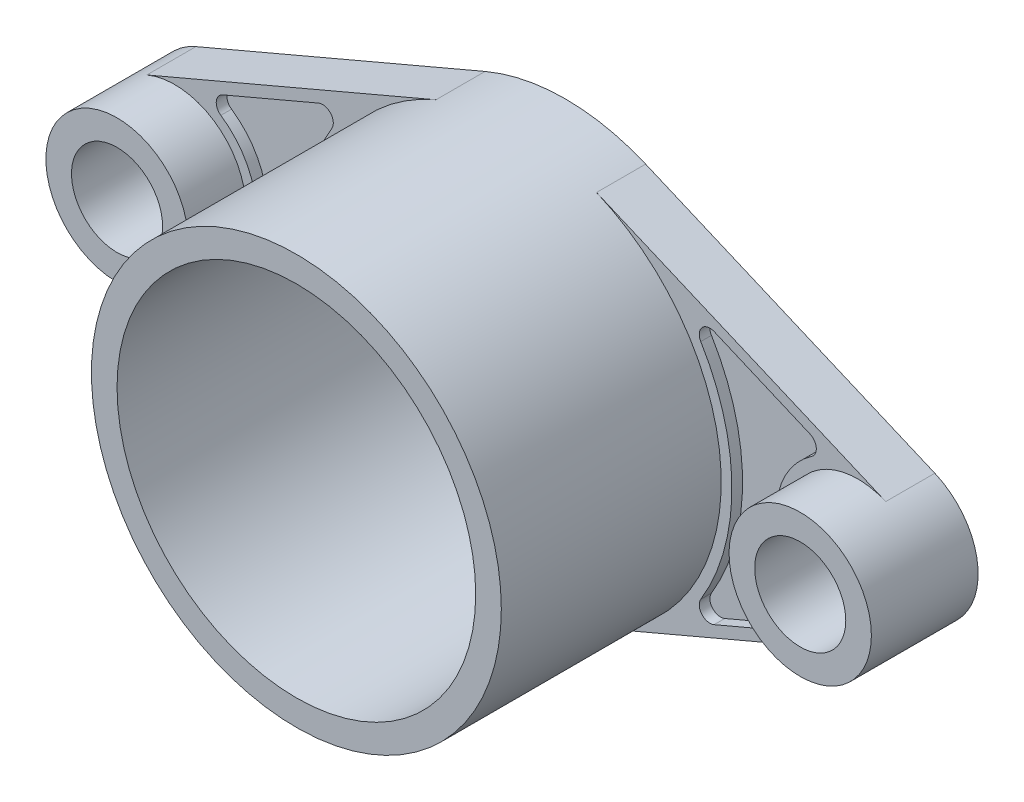
ISO-10303-21;
HEADER;
FILE_DESCRIPTION(('STEP AP214'),'2;1');
FILE_NAME('part.step','',(''),(''),'','','');
FILE_SCHEMA(('AUTOMOTIVE_DESIGN { 1 0 10303 214 1 1 1 1 }'));
ENDSEC;
DATA;
#1=APPLICATION_CONTEXT('core data for automotive mechanical design processes');
#2=APPLICATION_PROTOCOL_DEFINITION('international standard','automotive_design',2000,#1);
#3=PRODUCT_CONTEXT('',#1,'mechanical');
#4=PRODUCT('Part','Part','',(#3));
#5=PRODUCT_RELATED_PRODUCT_CATEGORY('part','',(#4));
#6=PRODUCT_DEFINITION_FORMATION('','',#4);
#7=PRODUCT_DEFINITION_CONTEXT('part definition',#1,'design');
#8=PRODUCT_DEFINITION('design','',#6,#7);
#9=PRODUCT_DEFINITION_SHAPE('','',#8);
#10=(LENGTH_UNIT() NAMED_UNIT(*) SI_UNIT(.MILLI.,.METRE.));
#11=(NAMED_UNIT(*) PLANE_ANGLE_UNIT() SI_UNIT($,.RADIAN.));
#12=(NAMED_UNIT(*) SI_UNIT($,.STERADIAN.) SOLID_ANGLE_UNIT());
#13=UNCERTAINTY_MEASURE_WITH_UNIT(LENGTH_MEASURE(1.E-05),#10,'distance_accuracy_value','');
#14=(GEOMETRIC_REPRESENTATION_CONTEXT(3) GLOBAL_UNCERTAINTY_ASSIGNED_CONTEXT((#13)) GLOBAL_UNIT_ASSIGNED_CONTEXT((#10,
#11,#12)) REPRESENTATION_CONTEXT('',''));
#15=CARTESIAN_POINT('',(0.,0.,0.));
#16=DIRECTION('',(0.,0.,1.));
#17=DIRECTION('',(1.,0.,0.));
#18=AXIS2_PLACEMENT_3D('',#15,#16,#17);
#19=CARTESIAN_POINT('',(-18.8,44.1651446278624,11.5));
#20=DIRECTION('',(0.391666666666667,-0.920107179747132,0.));
#21=DIRECTION('',(0.920107179747133,0.391666666666667,0.));
#22=AXIS2_PLACEMENT_3D('',#19,#20,#21);
#23=PLANE('',#22);
#24=DIRECTION('',(-0.920107179747133,-0.391666666666667,0.));
#25=VECTOR('',#24,1.);
#26=CARTESIAN_POINT('',(-18.8,44.1651446278624,0.));
#27=LINE('',#26,#25);
#28=CARTESIAN_POINT('',(-18.8,44.1651446278624,0.));
#29=VERTEX_POINT('',#28);
#30=CARTESIAN_POINT('',(-86.5277777777778,15.3351196624522,0.));
#31=VERTEX_POINT('',#30);
#32=EDGE_CURVE('E355',#29,#31,#27,.T.);
#33=ORIENTED_EDGE('',*,*,#32,.T.);
#34=DIRECTION('',(0.,0.,-1.));
#35=VECTOR('',#34,1.);
#36=CARTESIAN_POINT('',(-86.5277777777778,15.3351196624522,11.5));
#37=LINE('',#36,#35);
#38=CARTESIAN_POINT('',(-86.5277777777778,15.3351196624522,11.5));
#39=VERTEX_POINT('',#38);
#40=EDGE_CURVE('E11',#39,#31,#37,.T.);
#41=ORIENTED_EDGE('',*,*,#40,.F.);
#42=DIRECTION('',(-0.920107179747133,-0.391666666666667,0.));
#43=VECTOR('',#42,1.);
#44=CARTESIAN_POINT('',(-18.8,44.1651446278624,11.5));
#45=LINE('',#44,#43);
#46=CARTESIAN_POINT('',(-18.8,44.1651446278624,11.5));
#47=VERTEX_POINT('',#46);
#48=EDGE_CURVE('E377',#47,#39,#45,.T.);
#49=ORIENTED_EDGE('',*,*,#48,.F.);
#50=DIRECTION('',(0.,0.,-1.));
#51=VECTOR('',#50,1.);
#52=CARTESIAN_POINT('',(-18.8,44.1651446278624,11.5));
#53=LINE('',#52,#51);
#54=EDGE_CURVE('E391',#47,#29,#53,.T.);
#55=ORIENTED_EDGE('',*,*,#54,.T.);
#56=EDGE_LOOP('',(#33,#41,#49,#55));
#57=FACE_BOUND('',#56,.T.);
#58=ADVANCED_FACE('F47',(#57),#23,.F.);
#59=CARTESIAN_POINT('',(-18.8,-44.1651446278624,11.5));
#60=DIRECTION('',(-0.391666666666667,-0.920107179747133,0.));
#61=DIRECTION('',(0.920107179747133,-0.391666666666667,0.));
#62=AXIS2_PLACEMENT_3D('',#59,#60,#61);
#63=PLANE('',#62);
#64=DIRECTION('',(-0.920107179747133,0.391666666666667,0.));
#65=VECTOR('',#64,1.);
#66=CARTESIAN_POINT('',(-18.8,-44.1651446278624,0.));
#67=LINE('',#66,#65);
#68=CARTESIAN_POINT('',(-18.8,-44.1651446278624,0.));
#69=VERTEX_POINT('',#68);
#70=CARTESIAN_POINT('',(-86.5277777777778,-15.3351196624522,0.));
#71=VERTEX_POINT('',#70);
#72=EDGE_CURVE('E381',#69,#71,#67,.T.);
#73=ORIENTED_EDGE('',*,*,#72,.F.);
#74=DIRECTION('',(0.,0.,-1.));
#75=VECTOR('',#74,1.);
#76=CARTESIAN_POINT('',(-18.8,-44.1651446278624,11.5));
#77=LINE('',#76,#75);
#78=CARTESIAN_POINT('',(-18.8,-44.1651446278624,11.5));
#79=VERTEX_POINT('',#78);
#80=EDGE_CURVE('E399',#79,#69,#77,.T.);
#81=ORIENTED_EDGE('',*,*,#80,.F.);
#82=DIRECTION('',(-0.920107179747133,0.391666666666667,0.));
#83=VECTOR('',#82,1.);
#84=CARTESIAN_POINT('',(-18.8,-44.1651446278624,11.5));
#85=LINE('',#84,#83);
#86=CARTESIAN_POINT('',(-86.5277777777778,-15.3351196624522,11.5));
#87=VERTEX_POINT('',#86);
#88=EDGE_CURVE('E384',#79,#87,#85,.T.);
#89=ORIENTED_EDGE('',*,*,#88,.T.);
#90=DIRECTION('',(0.,0.,-1.));
#91=VECTOR('',#90,1.);
#92=CARTESIAN_POINT('',(-86.5277777777778,-15.3351196624522,11.5));
#93=LINE('',#92,#91);
#94=EDGE_CURVE('E55',#87,#71,#93,.T.);
#95=ORIENTED_EDGE('',*,*,#94,.T.);
#96=EDGE_LOOP('',(#73,#81,#89,#95));
#97=FACE_BOUND('',#96,.T.);
#98=ADVANCED_FACE('F408',(#97),#63,.T.);
#99=CARTESIAN_POINT('',(0.,0.,11.5));
#100=DIRECTION('',(0.,0.,1.));
#101=DIRECTION('',(1.,0.,0.));
#102=AXIS2_PLACEMENT_3D('',#99,#100,#101);
#103=PLANE('',#102);
#104=CARTESIAN_POINT('',(-80.,0.,11.5));
#105=DIRECTION('',(0.,0.,-1.));
#106=DIRECTION('',(1.,0.,0.));
#107=AXIS2_PLACEMENT_3D('',#104,#105,#106);
#108=CIRCLE('',#107,19.1666666666667);
#109=CARTESIAN_POINT('',(-69.181739923407,15.8217053450728,11.5));
#110=VERTEX_POINT('',#109);
#111=CARTESIAN_POINT('',(-69.181739923407,-15.8217053450728,11.5));
#112=VERTEX_POINT('',#111);
#113=EDGE_CURVE('E282',#110,#112,#108,.T.);
#114=ORIENTED_EDGE('',*,*,#113,.F.);
#115=CARTESIAN_POINT('',(-67.7706625221122,17.8854060422562,11.5));
#116=DIRECTION('',(0.,0.,1.));
#117=DIRECTION('',(-1.,0.,0.));
#118=AXIS2_PLACEMENT_3D('',#115,#116,#117);
#119=CIRCLE('',#118,2.5);
#120=CARTESIAN_POINT('',(-68.7498291887789,20.185673991624,11.5));
#121=VERTEX_POINT('',#120);
#122=EDGE_CURVE('E294',#121,#110,#119,.T.);
#123=ORIENTED_EDGE('',*,*,#122,.F.);
#124=DIRECTION('',(-0.920107179747132,-0.391666666666668,0.));
#125=VECTOR('',#124,1.);
#126=CARTESIAN_POINT('',(-46.3293116044255,29.729528860378,11.5));
#127=LINE('',#126,#125);
#128=CARTESIAN_POINT('',(-46.3293116044255,29.7295288603779,11.5));
#129=VERTEX_POINT('',#128);
#130=EDGE_CURVE('E345',#129,#121,#127,.T.);
#131=ORIENTED_EDGE('',*,*,#130,.F.);
#132=CARTESIAN_POINT('',(-45.3501449377588,27.4292609110101,11.5));
#133=DIRECTION('',(0.,0.,1.));
#134=DIRECTION('',(-1.,0.,0.));
#135=AXIS2_PLACEMENT_3D('',#132,#133,#134);
#136=CIRCLE('',#135,2.50000000000001);
#137=CARTESIAN_POINT('',(-43.2109871576759,26.13542784917,11.5));
#138=VERTEX_POINT('',#137);
#139=EDGE_CURVE('E341',#138,#129,#136,.T.);
#140=ORIENTED_EDGE('',*,*,#139,.F.);
#141=CARTESIAN_POINT('',(0.,0.,11.5));
#142=DIRECTION('',(0.,0.,-1.));
#143=DIRECTION('',(1.,0.,0.));
#144=AXIS2_PLACEMENT_3D('',#141,#142,#143);
#145=CIRCLE('',#144,50.5);
#146=CARTESIAN_POINT('',(-43.2109871576759,-26.13542784917,11.5));
#147=VERTEX_POINT('',#146);
#148=EDGE_CURVE('E337',#147,#138,#145,.T.);
#149=ORIENTED_EDGE('',*,*,#148,.F.);
#150=CARTESIAN_POINT('',(-45.3501449377588,-27.4292609110101,11.5));
#151=DIRECTION('',(0.,0.,1.));
#152=DIRECTION('',(1.,0.,0.));
#153=AXIS2_PLACEMENT_3D('',#150,#151,#152);
#154=CIRCLE('',#153,2.50000000000001);
#155=CARTESIAN_POINT('',(-46.3293116044255,-29.729528860378,11.5));
#156=VERTEX_POINT('',#155);
#157=EDGE_CURVE('E333',#156,#147,#154,.T.);
#158=ORIENTED_EDGE('',*,*,#157,.F.);
#159=DIRECTION('',(0.920107179747132,-0.391666666666668,0.));
#160=VECTOR('',#159,1.);
#161=CARTESIAN_POINT('',(-68.7498291887789,-20.185673991624,11.5));
#162=LINE('',#161,#160);
#163=CARTESIAN_POINT('',(-68.7498291887789,-20.185673991624,11.5));
#164=VERTEX_POINT('',#163);
#165=EDGE_CURVE('E329',#164,#156,#162,.T.);
#166=ORIENTED_EDGE('',*,*,#165,.F.);
#167=CARTESIAN_POINT('',(-67.7706625221122,-17.8854060422562,11.5));
#168=DIRECTION('',(0.,0.,1.));
#169=DIRECTION('',(1.,0.,0.));
#170=AXIS2_PLACEMENT_3D('',#167,#168,#169);
#171=CIRCLE('',#170,2.5);
#172=EDGE_CURVE('E325',#112,#164,#171,.T.);
#173=ORIENTED_EDGE('',*,*,#172,.F.);
#174=EDGE_LOOP('',(#114,#123,#131,#140,#149,#158,#166,#173));
#175=FACE_BOUND('',#174,.T.);
#176=ORIENTED_EDGE('',*,*,#48,.T.);
#177=CARTESIAN_POINT('',(-80.,0.,11.5));
#178=DIRECTION('',(0.,0.,1.));
#179=DIRECTION('',(1.,0.,0.));
#180=AXIS2_PLACEMENT_3D('',#177,#178,#179);
#181=CIRCLE('',#180,16.6666666666667);
#182=EDGE_CURVE('E380',#39,#87,#181,.F.);
#183=ORIENTED_EDGE('',*,*,#182,.T.);
#184=ORIENTED_EDGE('',*,*,#88,.F.);
#185=CARTESIAN_POINT('',(0.,0.,11.5));
#186=DIRECTION('',(0.,0.,1.));
#187=DIRECTION('',(1.,0.,0.));
#188=AXIS2_PLACEMENT_3D('',#185,#186,#187);
#189=CIRCLE('',#188,48.);
#190=EDGE_CURVE('E388',#47,#79,#189,.T.);
#191=ORIENTED_EDGE('',*,*,#190,.F.);
#192=EDGE_LOOP('',(#176,#183,#184,#191));
#193=FACE_BOUND('',#192,.T.);
#194=ADVANCED_FACE('F420',(#175,#193),#103,.T.);
#195=CARTESIAN_POINT('',(0.,0.,0.));
#196=DIRECTION('',(0.,0.,1.));
#197=DIRECTION('',(1.,0.,0.));
#198=AXIS2_PLACEMENT_3D('',#195,#196,#197);
#199=PLANE('',#198);
#200=ORIENTED_EDGE('',*,*,#32,.F.);
#201=CARTESIAN_POINT('',(0.,0.,0.));
#202=DIRECTION('',(0.,0.,1.));
#203=DIRECTION('',(1.,0.,0.));
#204=AXIS2_PLACEMENT_3D('',#201,#202,#203);
#205=CIRCLE('',#204,48.);
#206=CARTESIAN_POINT('',(18.8,44.1651446278624,0.));
#207=VERTEX_POINT('',#206);
#208=EDGE_CURVE('E236',#207,#29,#205,.T.);
#209=ORIENTED_EDGE('',*,*,#208,.F.);
#210=DIRECTION('',(0.920107179747133,-0.391666666666667,0.));
#211=VECTOR('',#210,1.);
#212=CARTESIAN_POINT('',(18.8,44.1651446278624,0.));
#213=LINE('',#212,#211);
#214=CARTESIAN_POINT('',(86.5277777777778,15.3351196624522,0.));
#215=VERTEX_POINT('',#214);
#216=EDGE_CURVE('E226',#207,#215,#213,.T.);
#217=ORIENTED_EDGE('',*,*,#216,.T.);
#218=CARTESIAN_POINT('',(80.,0.,0.));
#219=DIRECTION('',(0.,0.,1.));
#220=DIRECTION('',(1.,0.,0.));
#221=AXIS2_PLACEMENT_3D('',#218,#219,#220);
#222=CIRCLE('',#221,16.6666666666667);
#223=CARTESIAN_POINT('',(86.5277777777778,-15.3351196624522,0.));
#224=VERTEX_POINT('',#223);
#225=EDGE_CURVE('E207',#224,#215,#222,.T.);
#226=ORIENTED_EDGE('',*,*,#225,.F.);
#227=DIRECTION('',(0.920107179747133,0.391666666666667,0.));
#228=VECTOR('',#227,1.);
#229=CARTESIAN_POINT('',(18.8,-44.1651446278624,0.));
#230=LINE('',#229,#228);
#231=CARTESIAN_POINT('',(18.8,-44.1651446278624,0.));
#232=VERTEX_POINT('',#231);
#233=EDGE_CURVE('E238',#232,#224,#230,.T.);
#234=ORIENTED_EDGE('',*,*,#233,.F.);
#235=EDGE_CURVE('E263',#69,#232,#205,.T.);
#236=ORIENTED_EDGE('',*,*,#235,.F.);
#237=ORIENTED_EDGE('',*,*,#72,.T.);
#238=CARTESIAN_POINT('',(-80.,0.,0.));
#239=DIRECTION('',(0.,0.,1.));
#240=DIRECTION('',(1.,0.,0.));
#241=AXIS2_PLACEMENT_3D('',#238,#239,#240);
#242=CIRCLE('',#241,16.6666666666667);
#243=EDGE_CURVE('E267',#71,#31,#242,.F.);
#244=ORIENTED_EDGE('',*,*,#243,.T.);
#245=EDGE_LOOP('',(#200,#209,#217,#226,#234,#236,#237,#244));
#246=FACE_BOUND('',#245,.T.);
#247=CARTESIAN_POINT('',(-80.,0.,0.));
#248=DIRECTION('',(0.,0.,1.));
#249=DIRECTION('',(1.,0.,0.));
#250=AXIS2_PLACEMENT_3D('',#247,#248,#249);
#251=CIRCLE('',#250,10.6666666666667);
#252=CARTESIAN_POINT('',(-69.3333333333333,0.,0.));
#253=VERTEX_POINT('',#252);
#254=EDGE_CURVE('E278',#253,#253,#251,.F.);
#255=ORIENTED_EDGE('',*,*,#254,.F.);
#256=EDGE_LOOP('',(#255));
#257=FACE_BOUND('',#256,.T.);
#258=CARTESIAN_POINT('',(0.,0.,0.));
#259=DIRECTION('',(0.,0.,1.));
#260=DIRECTION('',(1.,0.,0.));
#261=AXIS2_PLACEMENT_3D('',#258,#259,#260);
#262=CIRCLE('',#261,42.);
#263=CARTESIAN_POINT('',(42.,0.,0.));
#264=VERTEX_POINT('',#263);
#265=EDGE_CURVE('E230',#264,#264,#262,.T.);
#266=ORIENTED_EDGE('',*,*,#265,.T.);
#267=EDGE_LOOP('',(#266));
#268=FACE_BOUND('',#267,.T.);
#269=CARTESIAN_POINT('',(80.,0.,0.));
#270=DIRECTION('',(0.,0.,1.));
#271=DIRECTION('',(1.,0.,0.));
#272=AXIS2_PLACEMENT_3D('',#269,#270,#271);
#273=CIRCLE('',#272,10.6666666666667);
#274=CARTESIAN_POINT('',(90.6666666666667,0.,0.));
#275=VERTEX_POINT('',#274);
#276=EDGE_CURVE('E220',#275,#275,#273,.T.);
#277=ORIENTED_EDGE('',*,*,#276,.T.);
#278=EDGE_LOOP('',(#277));
#279=FACE_BOUND('',#278,.T.);
#280=ADVANCED_FACE('F234',(#246,#257,#268,#279),#199,.F.);
#281=CARTESIAN_POINT('',(-80.,0.,9.));
#282=DIRECTION('',(0.,0.,1.));
#283=DIRECTION('',(1.,0.,0.));
#284=AXIS2_PLACEMENT_3D('',#281,#282,#283);
#285=CYLINDRICAL_SURFACE('',#284,19.1666666666667);
#286=ORIENTED_EDGE('',*,*,#113,.T.);
#287=DIRECTION('',(0.,0.,1.));
#288=VECTOR('',#287,1.);
#289=CARTESIAN_POINT('',(-69.181739923407,-15.8217053450728,9.));
#290=LINE('',#289,#288);
#291=CARTESIAN_POINT('',(-69.181739923407,-15.8217053450728,9.));
#292=VERTEX_POINT('',#291);
#293=EDGE_CURVE('E322',#292,#112,#290,.T.);
#294=ORIENTED_EDGE('',*,*,#293,.F.);
#295=CARTESIAN_POINT('',(-80.,0.,9.));
#296=DIRECTION('',(0.,0.,-1.));
#297=DIRECTION('',(1.,0.,0.));
#298=AXIS2_PLACEMENT_3D('',#295,#296,#297);
#299=CIRCLE('',#298,19.1666666666667);
#300=CARTESIAN_POINT('',(-69.181739923407,15.8217053450728,9.));
#301=VERTEX_POINT('',#300);
#302=EDGE_CURVE('E289',#301,#292,#299,.T.);
#303=ORIENTED_EDGE('',*,*,#302,.F.);
#304=DIRECTION('',(0.,0.,1.));
#305=VECTOR('',#304,1.);
#306=CARTESIAN_POINT('',(-69.181739923407,15.8217053450728,9.));
#307=LINE('',#306,#305);
#308=EDGE_CURVE('E352',#301,#110,#307,.T.);
#309=ORIENTED_EDGE('',*,*,#308,.T.);
#310=EDGE_LOOP('',(#286,#294,#303,#309));
#311=FACE_BOUND('',#310,.T.);
#312=ADVANCED_FACE('F552',(#311),#285,.T.);
#313=CARTESIAN_POINT('',(-67.7706625221122,17.8854060422562,9.));
#314=DIRECTION('',(0.,0.,1.));
#315=DIRECTION('',(1.,0.,0.));
#316=AXIS2_PLACEMENT_3D('',#313,#314,#315);
#317=CYLINDRICAL_SURFACE('',#316,2.5);
#318=ORIENTED_EDGE('',*,*,#122,.T.);
#319=ORIENTED_EDGE('',*,*,#308,.F.);
#320=CARTESIAN_POINT('',(-67.7706625221122,17.8854060422562,9.));
#321=DIRECTION('',(0.,0.,1.));
#322=DIRECTION('',(-1.,0.,0.));
#323=AXIS2_PLACEMENT_3D('',#320,#321,#322);
#324=CIRCLE('',#323,2.5);
#325=CARTESIAN_POINT('',(-68.7498291887789,20.185673991624,9.));
#326=VERTEX_POINT('',#325);
#327=EDGE_CURVE('E318',#326,#301,#324,.T.);
#328=ORIENTED_EDGE('',*,*,#327,.F.);
#329=DIRECTION('',(0.,0.,1.));
#330=VECTOR('',#329,1.);
#331=CARTESIAN_POINT('',(-68.7498291887789,20.185673991624,9.));
#332=LINE('',#331,#330);
#333=EDGE_CURVE('E356',#326,#121,#332,.T.);
#334=ORIENTED_EDGE('',*,*,#333,.T.);
#335=EDGE_LOOP('',(#318,#319,#328,#334));
#336=FACE_BOUND('',#335,.T.);
#337=ADVANCED_FACE('F556',(#336),#317,.F.);
#338=CARTESIAN_POINT('',(-46.3293116044255,29.729528860378,9.));
#339=DIRECTION('',(-0.391666666666668,0.920107179747132,0.));
#340=DIRECTION('',(-0.920107179747132,-0.391666666666668,0.));
#341=AXIS2_PLACEMENT_3D('',#338,#339,#340);
#342=PLANE('',#341);
#343=ORIENTED_EDGE('',*,*,#130,.T.);
#344=ORIENTED_EDGE('',*,*,#333,.F.);
#345=DIRECTION('',(-0.920107179747132,-0.391666666666668,0.));
#346=VECTOR('',#345,1.);
#347=CARTESIAN_POINT('',(-46.3293116044255,29.729528860378,9.));
#348=LINE('',#347,#346);
#349=CARTESIAN_POINT('',(-46.3293116044255,29.7295288603779,9.));
#350=VERTEX_POINT('',#349);
#351=EDGE_CURVE('E314',#350,#326,#348,.T.);
#352=ORIENTED_EDGE('',*,*,#351,.F.);
#353=DIRECTION('',(0.,0.,1.));
#354=VECTOR('',#353,1.);
#355=CARTESIAN_POINT('',(-46.3293116044255,29.7295288603779,9.));
#356=LINE('',#355,#354);
#357=EDGE_CURVE('E359',#350,#129,#356,.T.);
#358=ORIENTED_EDGE('',*,*,#357,.T.);
#359=EDGE_LOOP('',(#343,#344,#352,#358));
#360=FACE_BOUND('',#359,.T.);
#361=ADVANCED_FACE('F578',(#360),#342,.F.);
#362=CARTESIAN_POINT('',(-45.3501449377588,27.4292609110101,9.));
#363=DIRECTION('',(0.,0.,1.));
#364=DIRECTION('',(1.,0.,0.));
#365=AXIS2_PLACEMENT_3D('',#362,#363,#364);
#366=CYLINDRICAL_SURFACE('',#365,2.50000000000001);
#367=ORIENTED_EDGE('',*,*,#139,.T.);
#368=ORIENTED_EDGE('',*,*,#357,.F.);
#369=CARTESIAN_POINT('',(-45.3501449377588,27.4292609110101,9.));
#370=DIRECTION('',(0.,0.,1.));
#371=DIRECTION('',(-1.,0.,0.));
#372=AXIS2_PLACEMENT_3D('',#369,#370,#371);
#373=CIRCLE('',#372,2.50000000000001);
#374=CARTESIAN_POINT('',(-43.2109871576759,26.13542784917,9.));
#375=VERTEX_POINT('',#374);
#376=EDGE_CURVE('E310',#375,#350,#373,.T.);
#377=ORIENTED_EDGE('',*,*,#376,.F.);
#378=DIRECTION('',(0.,0.,1.));
#379=VECTOR('',#378,1.);
#380=CARTESIAN_POINT('',(-43.2109871576759,26.13542784917,9.));
#381=LINE('',#380,#379);
#382=EDGE_CURVE('E362',#375,#138,#381,.T.);
#383=ORIENTED_EDGE('',*,*,#382,.T.);
#384=EDGE_LOOP('',(#367,#368,#377,#383));
#385=FACE_BOUND('',#384,.T.);
#386=ADVANCED_FACE('F574',(#385),#366,.F.);
#387=CARTESIAN_POINT('',(0.,0.,9.));
#388=DIRECTION('',(0.,0.,1.));
#389=DIRECTION('',(1.,0.,0.));
#390=AXIS2_PLACEMENT_3D('',#387,#388,#389);
#391=CYLINDRICAL_SURFACE('',#390,50.5);
#392=ORIENTED_EDGE('',*,*,#148,.T.);
#393=ORIENTED_EDGE('',*,*,#382,.F.);
#394=CARTESIAN_POINT('',(0.,0.,9.));
#395=DIRECTION('',(0.,0.,-1.));
#396=DIRECTION('',(1.,0.,0.));
#397=AXIS2_PLACEMENT_3D('',#394,#395,#396);
#398=CIRCLE('',#397,50.5);
#399=CARTESIAN_POINT('',(-43.2109871576759,-26.13542784917,9.));
#400=VERTEX_POINT('',#399);
#401=EDGE_CURVE('E306',#400,#375,#398,.T.);
#402=ORIENTED_EDGE('',*,*,#401,.F.);
#403=DIRECTION('',(0.,0.,1.));
#404=VECTOR('',#403,1.);
#405=CARTESIAN_POINT('',(-43.2109871576759,-26.13542784917,9.));
#406=LINE('',#405,#404);
#407=EDGE_CURVE('E365',#400,#147,#406,.T.);
#408=ORIENTED_EDGE('',*,*,#407,.T.);
#409=EDGE_LOOP('',(#392,#393,#402,#408));
#410=FACE_BOUND('',#409,.T.);
#411=ADVANCED_FACE('F570',(#410),#391,.T.);
#412=CARTESIAN_POINT('',(-45.3501449377588,-27.4292609110101,9.));
#413=DIRECTION('',(0.,0.,1.));
#414=DIRECTION('',(1.,0.,0.));
#415=AXIS2_PLACEMENT_3D('',#412,#413,#414);
#416=CYLINDRICAL_SURFACE('',#415,2.50000000000001);
#417=ORIENTED_EDGE('',*,*,#157,.T.);
#418=ORIENTED_EDGE('',*,*,#407,.F.);
#419=CARTESIAN_POINT('',(-45.3501449377588,-27.4292609110101,9.));
#420=DIRECTION('',(0.,0.,1.));
#421=DIRECTION('',(1.,0.,0.));
#422=AXIS2_PLACEMENT_3D('',#419,#420,#421);
#423=CIRCLE('',#422,2.50000000000001);
#424=CARTESIAN_POINT('',(-46.3293116044255,-29.729528860378,9.));
#425=VERTEX_POINT('',#424);
#426=EDGE_CURVE('E302',#425,#400,#423,.T.);
#427=ORIENTED_EDGE('',*,*,#426,.F.);
#428=DIRECTION('',(0.,0.,1.));
#429=VECTOR('',#428,1.);
#430=CARTESIAN_POINT('',(-46.3293116044255,-29.729528860378,9.));
#431=LINE('',#430,#429);
#432=EDGE_CURVE('E368',#425,#156,#431,.T.);
#433=ORIENTED_EDGE('',*,*,#432,.T.);
#434=EDGE_LOOP('',(#417,#418,#427,#433));
#435=FACE_BOUND('',#434,.T.);
#436=ADVANCED_FACE('F566',(#435),#416,.F.);
#437=CARTESIAN_POINT('',(-68.7498291887789,-20.185673991624,9.));
#438=DIRECTION('',(-0.391666666666668,-0.920107179747132,0.));
#439=DIRECTION('',(0.920107179747132,-0.391666666666668,0.));
#440=AXIS2_PLACEMENT_3D('',#437,#438,#439);
#441=PLANE('',#440);
#442=ORIENTED_EDGE('',*,*,#165,.T.);
#443=ORIENTED_EDGE('',*,*,#432,.F.);
#444=DIRECTION('',(0.920107179747132,-0.391666666666668,0.));
#445=VECTOR('',#444,1.);
#446=CARTESIAN_POINT('',(-68.7498291887789,-20.185673991624,9.));
#447=LINE('',#446,#445);
#448=CARTESIAN_POINT('',(-68.7498291887789,-20.185673991624,9.));
#449=VERTEX_POINT('',#448);
#450=EDGE_CURVE('E298',#449,#425,#447,.T.);
#451=ORIENTED_EDGE('',*,*,#450,.F.);
#452=DIRECTION('',(0.,0.,1.));
#453=VECTOR('',#452,1.);
#454=CARTESIAN_POINT('',(-68.7498291887789,-20.185673991624,9.));
#455=LINE('',#454,#453);
#456=EDGE_CURVE('E371',#449,#164,#455,.T.);
#457=ORIENTED_EDGE('',*,*,#456,.T.);
#458=EDGE_LOOP('',(#442,#443,#451,#457));
#459=FACE_BOUND('',#458,.T.);
#460=ADVANCED_FACE('F562',(#459),#441,.F.);
#461=CARTESIAN_POINT('',(-67.7706625221122,-17.8854060422562,9.));
#462=DIRECTION('',(0.,0.,1.));
#463=DIRECTION('',(1.,0.,0.));
#464=AXIS2_PLACEMENT_3D('',#461,#462,#463);
#465=CYLINDRICAL_SURFACE('',#464,2.5);
#466=ORIENTED_EDGE('',*,*,#172,.T.);
#467=ORIENTED_EDGE('',*,*,#456,.F.);
#468=CARTESIAN_POINT('',(-67.7706625221122,-17.8854060422562,9.));
#469=DIRECTION('',(0.,0.,1.));
#470=DIRECTION('',(1.,0.,0.));
#471=AXIS2_PLACEMENT_3D('',#468,#469,#470);
#472=CIRCLE('',#471,2.5);
#473=EDGE_CURVE('E293',#292,#449,#472,.T.);
#474=ORIENTED_EDGE('',*,*,#473,.F.);
#475=ORIENTED_EDGE('',*,*,#293,.T.);
#476=EDGE_LOOP('',(#466,#467,#474,#475));
#477=FACE_BOUND('',#476,.T.);
#478=ADVANCED_FACE('F558',(#477),#465,.F.);
#479=CARTESIAN_POINT('',(-80.,0.,9.));
#480=DIRECTION('',(0.,0.,1.));
#481=DIRECTION('',(1.,0.,0.));
#482=AXIS2_PLACEMENT_3D('',#479,#480,#481);
#483=PLANE('',#482);
#484=ORIENTED_EDGE('',*,*,#302,.T.);
#485=ORIENTED_EDGE('',*,*,#473,.T.);
#486=ORIENTED_EDGE('',*,*,#450,.T.);
#487=ORIENTED_EDGE('',*,*,#426,.T.);
#488=ORIENTED_EDGE('',*,*,#401,.T.);
#489=ORIENTED_EDGE('',*,*,#376,.T.);
#490=ORIENTED_EDGE('',*,*,#351,.T.);
#491=ORIENTED_EDGE('',*,*,#327,.T.);
#492=EDGE_LOOP('',(#484,#485,#486,#487,#488,#489,#490,#491));
#493=FACE_BOUND('',#492,.T.);
#494=ADVANCED_FACE('F561',(#493),#483,.T.);
#495=CARTESIAN_POINT('',(-80.,0.,25.));
#496=DIRECTION('',(0.,0.,-1.));
#497=DIRECTION('',(-1.,0.,0.));
#498=AXIS2_PLACEMENT_3D('',#495,#496,#497);
#499=CYLINDRICAL_SURFACE('',#498,16.6666666666667);
#500=ORIENTED_EDGE('',*,*,#182,.F.);
#501=ORIENTED_EDGE('',*,*,#40,.T.);
#502=ORIENTED_EDGE('',*,*,#243,.F.);
#503=ORIENTED_EDGE('',*,*,#94,.F.);
#504=EDGE_LOOP('',(#500,#501,#502,#503));
#505=FACE_BOUND('',#504,.T.);
#506=CARTESIAN_POINT('',(-80.,0.,25.));
#507=DIRECTION('',(0.,0.,1.));
#508=DIRECTION('',(1.,0.,0.));
#509=AXIS2_PLACEMENT_3D('',#506,#507,#508);
#510=CIRCLE('',#509,16.6666666666667);
#511=CARTESIAN_POINT('',(-63.3333333333333,0.,25.));
#512=VERTEX_POINT('',#511);
#513=EDGE_CURVE('E273',#512,#512,#510,.F.);
#514=ORIENTED_EDGE('',*,*,#513,.T.);
#515=EDGE_LOOP('',(#514));
#516=FACE_BOUND('',#515,.T.);
#517=ADVANCED_FACE('F413',(#505,#516),#499,.T.);
#518=CARTESIAN_POINT('',(-80.,0.,25.));
#519=DIRECTION('',(0.,0.,-1.));
#520=DIRECTION('',(-1.,0.,0.));
#521=AXIS2_PLACEMENT_3D('',#518,#519,#520);
#522=CYLINDRICAL_SURFACE('',#521,10.6666666666667);
#523=CARTESIAN_POINT('',(-80.,0.,25.));
#524=DIRECTION('',(0.,0.,1.));
#525=DIRECTION('',(1.,0.,0.));
#526=AXIS2_PLACEMENT_3D('',#523,#524,#525);
#527=CIRCLE('',#526,10.6666666666667);
#528=CARTESIAN_POINT('',(-69.3333333333333,0.,25.));
#529=VERTEX_POINT('',#528);
#530=EDGE_CURVE('E277',#529,#529,#527,.F.);
#531=ORIENTED_EDGE('',*,*,#530,.F.);
#532=EDGE_LOOP('',(#531));
#533=FACE_BOUND('',#532,.T.);
#534=ORIENTED_EDGE('',*,*,#254,.T.);
#535=EDGE_LOOP('',(#534));
#536=FACE_BOUND('',#535,.T.);
#537=ADVANCED_FACE('F591',(#533,#536),#522,.F.);
#538=CARTESIAN_POINT('',(0.,0.,25.));
#539=DIRECTION('',(0.,0.,1.));
#540=DIRECTION('',(1.,0.,0.));
#541=AXIS2_PLACEMENT_3D('',#538,#539,#540);
#542=PLANE('',#541);
#543=ORIENTED_EDGE('',*,*,#513,.F.);
#544=EDGE_LOOP('',(#543));
#545=FACE_BOUND('',#544,.T.);
#546=ORIENTED_EDGE('',*,*,#530,.T.);
#547=EDGE_LOOP('',(#546));
#548=FACE_BOUND('',#547,.T.);
#549=ADVANCED_FACE('F594',(#545,#548),#542,.T.);
#550=CARTESIAN_POINT('',(0.,0.,63.));
#551=DIRECTION('',(0.,0.,-1.));
#552=DIRECTION('',(-1.,0.,0.));
#553=AXIS2_PLACEMENT_3D('',#550,#551,#552);
#554=CYLINDRICAL_SURFACE('',#553,48.);
#555=CARTESIAN_POINT('',(0.,0.,11.5));
#556=DIRECTION('',(0.,0.,1.));
#557=DIRECTION('',(1.,0.,0.));
#558=AXIS2_PLACEMENT_3D('',#555,#556,#557);
#559=CIRCLE('',#558,48.);
#560=CARTESIAN_POINT('',(18.8,-44.1651446278624,11.5));
#561=VERTEX_POINT('',#560);
#562=CARTESIAN_POINT('',(18.8,44.1651446278624,11.5));
#563=VERTEX_POINT('',#562);
#564=EDGE_CURVE('E62',#561,#563,#559,.T.);
#565=ORIENTED_EDGE('',*,*,#564,.T.);
#566=DIRECTION('',(0.,0.,-1.));
#567=VECTOR('',#566,1.);
#568=CARTESIAN_POINT('',(18.8,44.1651446278624,11.5));
#569=LINE('',#568,#567);
#570=EDGE_CURVE('E231',#563,#207,#569,.T.);
#571=ORIENTED_EDGE('',*,*,#570,.T.);
#572=ORIENTED_EDGE('',*,*,#208,.T.);
#573=ORIENTED_EDGE('',*,*,#54,.F.);
#574=ORIENTED_EDGE('',*,*,#190,.T.);
#575=ORIENTED_EDGE('',*,*,#80,.T.);
#576=ORIENTED_EDGE('',*,*,#235,.T.);
#577=DIRECTION('',(0.,0.,-1.));
#578=VECTOR('',#577,1.);
#579=CARTESIAN_POINT('',(18.8,-44.1651446278624,11.5));
#580=LINE('',#579,#578);
#581=EDGE_CURVE('E67',#561,#232,#580,.T.);
#582=ORIENTED_EDGE('',*,*,#581,.F.);
#583=EDGE_LOOP('',(#565,#571,#572,#573,#574,#575,#576,#582));
#584=FACE_BOUND('',#583,.T.);
#585=CARTESIAN_POINT('',(0.,0.,63.));
#586=DIRECTION('',(0.,0.,1.));
#587=DIRECTION('',(1.,0.,0.));
#588=AXIS2_PLACEMENT_3D('',#585,#586,#587);
#589=CIRCLE('',#588,48.);
#590=CARTESIAN_POINT('',(48.,0.,63.));
#591=VERTEX_POINT('',#590);
#592=EDGE_CURVE('E262',#591,#591,#589,.T.);
#593=ORIENTED_EDGE('',*,*,#592,.F.);
#594=EDGE_LOOP('',(#593));
#595=FACE_BOUND('',#594,.T.);
#596=ADVANCED_FACE('F416',(#584,#595),#554,.T.);
#597=CARTESIAN_POINT('',(0.,0.,63.));
#598=DIRECTION('',(0.,0.,-1.));
#599=DIRECTION('',(-1.,0.,0.));
#600=AXIS2_PLACEMENT_3D('',#597,#598,#599);
#601=CYLINDRICAL_SURFACE('',#600,42.);
#602=CARTESIAN_POINT('',(0.,0.,63.));
#603=DIRECTION('',(0.,0.,1.));
#604=DIRECTION('',(1.,0.,0.));
#605=AXIS2_PLACEMENT_3D('',#602,#603,#604);
#606=CIRCLE('',#605,42.);
#607=CARTESIAN_POINT('',(42.,0.,63.));
#608=VERTEX_POINT('',#607);
#609=EDGE_CURVE('E258',#608,#608,#606,.T.);
#610=ORIENTED_EDGE('',*,*,#609,.T.);
#611=EDGE_LOOP('',(#610));
#612=FACE_BOUND('',#611,.T.);
#613=ORIENTED_EDGE('',*,*,#265,.F.);
#614=EDGE_LOOP('',(#613));
#615=FACE_BOUND('',#614,.T.);
#616=ADVANCED_FACE('F598',(#612,#615),#601,.F.);
#617=CARTESIAN_POINT('',(0.,0.,63.));
#618=DIRECTION('',(0.,0.,1.));
#619=DIRECTION('',(1.,0.,0.));
#620=AXIS2_PLACEMENT_3D('',#617,#618,#619);
#621=PLANE('',#620);
#622=ORIENTED_EDGE('',*,*,#609,.F.);
#623=EDGE_LOOP('',(#622));
#624=FACE_BOUND('',#623,.T.);
#625=ORIENTED_EDGE('',*,*,#592,.T.);
#626=EDGE_LOOP('',(#625));
#627=FACE_BOUND('',#626,.T.);
#628=ADVANCED_FACE('F601',(#624,#627),#621,.T.);
#629=CARTESIAN_POINT('',(18.8,44.1651446278624,11.5));
#630=DIRECTION('',(0.391666666666667,0.920107179747133,0.));
#631=DIRECTION('',(-0.920107179747133,0.391666666666667,0.));
#632=AXIS2_PLACEMENT_3D('',#629,#630,#631);
#633=PLANE('',#632);
#634=ORIENTED_EDGE('',*,*,#216,.F.);
#635=ORIENTED_EDGE('',*,*,#570,.F.);
#636=DIRECTION('',(0.920107179747133,-0.391666666666667,0.));
#637=VECTOR('',#636,1.);
#638=CARTESIAN_POINT('',(18.8,44.1651446278624,11.5));
#639=LINE('',#638,#637);
#640=CARTESIAN_POINT('',(86.5277777777778,15.3351196624522,11.5));
#641=VERTEX_POINT('',#640);
#642=EDGE_CURVE('E228',#563,#641,#639,.T.);
#643=ORIENTED_EDGE('',*,*,#642,.T.);
#644=DIRECTION('',(0.,0.,-1.));
#645=VECTOR('',#644,1.);
#646=CARTESIAN_POINT('',(86.5277777777778,15.3351196624522,11.5));
#647=LINE('',#646,#645);
#648=EDGE_CURVE('E210',#641,#215,#647,.T.);
#649=ORIENTED_EDGE('',*,*,#648,.T.);
#650=EDGE_LOOP('',(#634,#635,#643,#649));
#651=FACE_BOUND('',#650,.T.);
#652=ADVANCED_FACE('F225',(#651),#633,.T.);
#653=CARTESIAN_POINT('',(18.8,-44.1651446278624,11.5));
#654=DIRECTION('',(-0.391666666666667,0.920107179747133,0.));
#655=DIRECTION('',(-0.920107179747133,-0.391666666666667,0.));
#656=AXIS2_PLACEMENT_3D('',#653,#654,#655);
#657=PLANE('',#656);
#658=ORIENTED_EDGE('',*,*,#233,.T.);
#659=DIRECTION('',(0.,0.,-1.));
#660=VECTOR('',#659,1.);
#661=CARTESIAN_POINT('',(86.5277777777778,-15.3351196624522,11.5));
#662=LINE('',#661,#660);
#663=CARTESIAN_POINT('',(86.5277777777778,-15.3351196624522,11.5));
#664=VERTEX_POINT('',#663);
#665=EDGE_CURVE('E213',#664,#224,#662,.T.);
#666=ORIENTED_EDGE('',*,*,#665,.F.);
#667=DIRECTION('',(0.920107179747133,0.391666666666667,0.));
#668=VECTOR('',#667,1.);
#669=CARTESIAN_POINT('',(18.8,-44.1651446278624,11.5));
#670=LINE('',#669,#668);
#671=EDGE_CURVE('E249',#561,#664,#670,.T.);
#672=ORIENTED_EDGE('',*,*,#671,.F.);
#673=ORIENTED_EDGE('',*,*,#581,.T.);
#674=EDGE_LOOP('',(#658,#666,#672,#673));
#675=FACE_BOUND('',#674,.T.);
#676=ADVANCED_FACE('F610',(#675),#657,.F.);
#677=CARTESIAN_POINT('',(0.,0.,11.5));
#678=DIRECTION('',(0.,0.,1.));
#679=DIRECTION('',(1.,0.,0.));
#680=AXIS2_PLACEMENT_3D('',#677,#678,#679);
#681=PLANE('',#680);
#682=CARTESIAN_POINT('',(80.,0.,11.5));
#683=DIRECTION('',(0.,0.,1.));
#684=DIRECTION('',(-1.,0.,0.));
#685=AXIS2_PLACEMENT_3D('',#682,#683,#684);
#686=CIRCLE('',#685,19.1666666666667);
#687=CARTESIAN_POINT('',(69.181739923407,15.8217053450728,11.5));
#688=VERTEX_POINT('',#687);
#689=CARTESIAN_POINT('',(69.181739923407,-15.8217053450728,11.5));
#690=VERTEX_POINT('',#689);
#691=EDGE_CURVE('E239',#688,#690,#686,.T.);
#692=ORIENTED_EDGE('',*,*,#691,.T.);
#693=CARTESIAN_POINT('',(67.7706625221122,-17.8854060422562,11.5));
#694=DIRECTION('',(0.,0.,-1.));
#695=DIRECTION('',(-1.,0.,0.));
#696=AXIS2_PLACEMENT_3D('',#693,#694,#695);
#697=CIRCLE('',#696,2.5);
#698=CARTESIAN_POINT('',(68.7498291887789,-20.185673991624,11.5));
#699=VERTEX_POINT('',#698);
#700=EDGE_CURVE('E505',#690,#699,#697,.T.);
#701=ORIENTED_EDGE('',*,*,#700,.T.);
#702=DIRECTION('',(-0.920107179747132,-0.391666666666668,0.));
#703=VECTOR('',#702,1.);
#704=CARTESIAN_POINT('',(68.7498291887789,-20.185673991624,11.5));
#705=LINE('',#704,#703);
#706=CARTESIAN_POINT('',(46.3293116044255,-29.729528860378,11.5));
#707=VERTEX_POINT('',#706);
#708=EDGE_CURVE('E469',#699,#707,#705,.T.);
#709=ORIENTED_EDGE('',*,*,#708,.T.);
#710=CARTESIAN_POINT('',(45.3501449377588,-27.4292609110101,11.5));
#711=DIRECTION('',(0.,0.,-1.));
#712=DIRECTION('',(-1.,0.,0.));
#713=AXIS2_PLACEMENT_3D('',#710,#711,#712);
#714=CIRCLE('',#713,2.50000000000001);
#715=CARTESIAN_POINT('',(43.2109871576759,-26.13542784917,11.5));
#716=VERTEX_POINT('',#715);
#717=EDGE_CURVE('E462',#707,#716,#714,.T.);
#718=ORIENTED_EDGE('',*,*,#717,.T.);
#719=CARTESIAN_POINT('',(0.,0.,11.5));
#720=DIRECTION('',(0.,0.,1.));
#721=DIRECTION('',(-1.,0.,0.));
#722=AXIS2_PLACEMENT_3D('',#719,#720,#721);
#723=CIRCLE('',#722,50.5);
#724=CARTESIAN_POINT('',(43.2109871576759,26.13542784917,11.5));
#725=VERTEX_POINT('',#724);
#726=EDGE_CURVE('E455',#716,#725,#723,.T.);
#727=ORIENTED_EDGE('',*,*,#726,.T.);
#728=CARTESIAN_POINT('',(45.3501449377588,27.4292609110101,11.5));
#729=DIRECTION('',(0.,0.,-1.));
#730=DIRECTION('',(1.,0.,0.));
#731=AXIS2_PLACEMENT_3D('',#728,#729,#730);
#732=CIRCLE('',#731,2.50000000000001);
#733=CARTESIAN_POINT('',(46.3293116044255,29.7295288603779,11.5));
#734=VERTEX_POINT('',#733);
#735=EDGE_CURVE('E448',#725,#734,#732,.T.);
#736=ORIENTED_EDGE('',*,*,#735,.T.);
#737=DIRECTION('',(0.920107179747132,-0.391666666666668,0.));
#738=VECTOR('',#737,1.);
#739=CARTESIAN_POINT('',(46.3293116044255,29.729528860378,11.5));
#740=LINE('',#739,#738);
#741=CARTESIAN_POINT('',(68.7498291887789,20.185673991624,11.5));
#742=VERTEX_POINT('',#741);
#743=EDGE_CURVE('E441',#734,#742,#740,.T.);
#744=ORIENTED_EDGE('',*,*,#743,.T.);
#745=CARTESIAN_POINT('',(67.7706625221122,17.8854060422562,11.5));
#746=DIRECTION('',(0.,0.,-1.));
#747=DIRECTION('',(1.,0.,0.));
#748=AXIS2_PLACEMENT_3D('',#745,#746,#747);
#749=CIRCLE('',#748,2.5);
#750=EDGE_CURVE('E434',#742,#688,#749,.T.);
#751=ORIENTED_EDGE('',*,*,#750,.T.);
#752=EDGE_LOOP('',(#692,#701,#709,#718,#727,#736,#744,#751));
#753=FACE_BOUND('',#752,.T.);
#754=CARTESIAN_POINT('',(80.,0.,11.5));
#755=DIRECTION('',(0.,0.,1.));
#756=DIRECTION('',(1.,0.,0.));
#757=AXIS2_PLACEMENT_3D('',#754,#755,#756);
#758=CIRCLE('',#757,16.6666666666667);
#759=EDGE_CURVE('E243',#641,#664,#758,.T.);
#760=ORIENTED_EDGE('',*,*,#759,.F.);
#761=ORIENTED_EDGE('',*,*,#642,.F.);
#762=ORIENTED_EDGE('',*,*,#564,.F.);
#763=ORIENTED_EDGE('',*,*,#671,.T.);
#764=EDGE_LOOP('',(#760,#761,#762,#763));
#765=FACE_BOUND('',#764,.T.);
#766=ADVANCED_FACE('F613',(#753,#765),#681,.T.);
#767=CARTESIAN_POINT('',(80.,0.,9.));
#768=DIRECTION('',(0.,0.,1.));
#769=DIRECTION('',(-1.,0.,0.));
#770=AXIS2_PLACEMENT_3D('',#767,#768,#769);
#771=CYLINDRICAL_SURFACE('',#770,19.1666666666667);
#772=ORIENTED_EDGE('',*,*,#691,.F.);
#773=DIRECTION('',(0.,0.,1.));
#774=VECTOR('',#773,1.);
#775=CARTESIAN_POINT('',(69.181739923407,15.8217053450728,9.));
#776=LINE('',#775,#774);
#777=CARTESIAN_POINT('',(69.181739923407,15.8217053450728,9.));
#778=VERTEX_POINT('',#777);
#779=EDGE_CURVE('E246',#778,#688,#776,.T.);
#780=ORIENTED_EDGE('',*,*,#779,.F.);
#781=CARTESIAN_POINT('',(80.,0.,9.));
#782=DIRECTION('',(0.,0.,1.));
#783=DIRECTION('',(-1.,0.,0.));
#784=AXIS2_PLACEMENT_3D('',#781,#782,#783);
#785=CIRCLE('',#784,19.1666666666667);
#786=CARTESIAN_POINT('',(69.181739923407,-15.8217053450728,9.));
#787=VERTEX_POINT('',#786);
#788=EDGE_CURVE('E501',#778,#787,#785,.T.);
#789=ORIENTED_EDGE('',*,*,#788,.T.);
#790=DIRECTION('',(0.,0.,1.));
#791=VECTOR('',#790,1.);
#792=CARTESIAN_POINT('',(69.181739923407,-15.8217053450728,9.));
#793=LINE('',#792,#791);
#794=EDGE_CURVE('E473',#787,#690,#793,.T.);
#795=ORIENTED_EDGE('',*,*,#794,.T.);
#796=EDGE_LOOP('',(#772,#780,#789,#795));
#797=FACE_BOUND('',#796,.T.);
#798=ADVANCED_FACE('F617',(#797),#771,.T.);
#799=CARTESIAN_POINT('',(67.7706625221122,17.8854060422562,9.));
#800=DIRECTION('',(0.,0.,1.));
#801=DIRECTION('',(-1.,0.,0.));
#802=AXIS2_PLACEMENT_3D('',#799,#800,#801);
#803=CYLINDRICAL_SURFACE('',#802,2.5);
#804=ORIENTED_EDGE('',*,*,#750,.F.);
#805=DIRECTION('',(0.,0.,1.));
#806=VECTOR('',#805,1.);
#807=CARTESIAN_POINT('',(68.7498291887789,20.185673991624,9.));
#808=LINE('',#807,#806);
#809=CARTESIAN_POINT('',(68.7498291887789,20.185673991624,9.));
#810=VERTEX_POINT('',#809);
#811=EDGE_CURVE('E438',#810,#742,#808,.T.);
#812=ORIENTED_EDGE('',*,*,#811,.F.);
#813=CARTESIAN_POINT('',(67.7706625221122,17.8854060422562,9.));
#814=DIRECTION('',(0.,0.,-1.));
#815=DIRECTION('',(1.,0.,0.));
#816=AXIS2_PLACEMENT_3D('',#813,#814,#815);
#817=CIRCLE('',#816,2.5);
#818=EDGE_CURVE('E480',#810,#778,#817,.T.);
#819=ORIENTED_EDGE('',*,*,#818,.T.);
#820=ORIENTED_EDGE('',*,*,#779,.T.);
#821=EDGE_LOOP('',(#804,#812,#819,#820));
#822=FACE_BOUND('',#821,.T.);
#823=ADVANCED_FACE('F621',(#822),#803,.F.);
#824=CARTESIAN_POINT('',(46.3293116044255,29.729528860378,9.));
#825=DIRECTION('',(0.391666666666668,0.920107179747132,0.));
#826=DIRECTION('',(0.920107179747132,-0.391666666666668,0.));
#827=AXIS2_PLACEMENT_3D('',#824,#825,#826);
#828=PLANE('',#827);
#829=ORIENTED_EDGE('',*,*,#743,.F.);
#830=DIRECTION('',(0.,0.,1.));
#831=VECTOR('',#830,1.);
#832=CARTESIAN_POINT('',(46.3293116044255,29.7295288603779,9.));
#833=LINE('',#832,#831);
#834=CARTESIAN_POINT('',(46.3293116044255,29.7295288603779,9.));
#835=VERTEX_POINT('',#834);
#836=EDGE_CURVE('E445',#835,#734,#833,.T.);
#837=ORIENTED_EDGE('',*,*,#836,.F.);
#838=DIRECTION('',(0.920107179747132,-0.391666666666668,0.));
#839=VECTOR('',#838,1.);
#840=CARTESIAN_POINT('',(46.3293116044255,29.729528860378,9.));
#841=LINE('',#840,#839);
#842=EDGE_CURVE('E483',#835,#810,#841,.T.);
#843=ORIENTED_EDGE('',*,*,#842,.T.);
#844=ORIENTED_EDGE('',*,*,#811,.T.);
#845=EDGE_LOOP('',(#829,#837,#843,#844));
#846=FACE_BOUND('',#845,.T.);
#847=ADVANCED_FACE('F625',(#846),#828,.F.);
#848=CARTESIAN_POINT('',(45.3501449377588,27.4292609110101,9.));
#849=DIRECTION('',(0.,0.,1.));
#850=DIRECTION('',(-1.,0.,0.));
#851=AXIS2_PLACEMENT_3D('',#848,#849,#850);
#852=CYLINDRICAL_SURFACE('',#851,2.50000000000001);
#853=ORIENTED_EDGE('',*,*,#735,.F.);
#854=DIRECTION('',(0.,0.,1.));
#855=VECTOR('',#854,1.);
#856=CARTESIAN_POINT('',(43.2109871576759,26.13542784917,9.));
#857=LINE('',#856,#855);
#858=CARTESIAN_POINT('',(43.2109871576759,26.13542784917,9.));
#859=VERTEX_POINT('',#858);
#860=EDGE_CURVE('E452',#859,#725,#857,.T.);
#861=ORIENTED_EDGE('',*,*,#860,.F.);
#862=CARTESIAN_POINT('',(45.3501449377588,27.4292609110101,9.));
#863=DIRECTION('',(0.,0.,-1.));
#864=DIRECTION('',(1.,0.,0.));
#865=AXIS2_PLACEMENT_3D('',#862,#863,#864);
#866=CIRCLE('',#865,2.50000000000001);
#867=EDGE_CURVE('E486',#859,#835,#866,.T.);
#868=ORIENTED_EDGE('',*,*,#867,.T.);
#869=ORIENTED_EDGE('',*,*,#836,.T.);
#870=EDGE_LOOP('',(#853,#861,#868,#869));
#871=FACE_BOUND('',#870,.T.);
#872=ADVANCED_FACE('F629',(#871),#852,.F.);
#873=CARTESIAN_POINT('',(0.,0.,9.));
#874=DIRECTION('',(0.,0.,1.));
#875=DIRECTION('',(-1.,0.,0.));
#876=AXIS2_PLACEMENT_3D('',#873,#874,#875);
#877=CYLINDRICAL_SURFACE('',#876,50.5);
#878=ORIENTED_EDGE('',*,*,#726,.F.);
#879=DIRECTION('',(0.,0.,1.));
#880=VECTOR('',#879,1.);
#881=CARTESIAN_POINT('',(43.2109871576759,-26.13542784917,9.));
#882=LINE('',#881,#880);
#883=CARTESIAN_POINT('',(43.2109871576759,-26.13542784917,9.));
#884=VERTEX_POINT('',#883);
#885=EDGE_CURVE('E459',#884,#716,#882,.T.);
#886=ORIENTED_EDGE('',*,*,#885,.F.);
#887=CARTESIAN_POINT('',(0.,0.,9.));
#888=DIRECTION('',(0.,0.,1.));
#889=DIRECTION('',(-1.,0.,0.));
#890=AXIS2_PLACEMENT_3D('',#887,#888,#889);
#891=CIRCLE('',#890,50.5);
#892=EDGE_CURVE('E489',#884,#859,#891,.T.);
#893=ORIENTED_EDGE('',*,*,#892,.T.);
#894=ORIENTED_EDGE('',*,*,#860,.T.);
#895=EDGE_LOOP('',(#878,#886,#893,#894));
#896=FACE_BOUND('',#895,.T.);
#897=ADVANCED_FACE('F633',(#896),#877,.T.);
#898=CARTESIAN_POINT('',(45.3501449377588,-27.4292609110101,9.));
#899=DIRECTION('',(0.,0.,1.));
#900=DIRECTION('',(-1.,0.,0.));
#901=AXIS2_PLACEMENT_3D('',#898,#899,#900);
#902=CYLINDRICAL_SURFACE('',#901,2.50000000000001);
#903=ORIENTED_EDGE('',*,*,#717,.F.);
#904=DIRECTION('',(0.,0.,1.));
#905=VECTOR('',#904,1.);
#906=CARTESIAN_POINT('',(46.3293116044255,-29.729528860378,9.));
#907=LINE('',#906,#905);
#908=CARTESIAN_POINT('',(46.3293116044255,-29.729528860378,9.));
#909=VERTEX_POINT('',#908);
#910=EDGE_CURVE('E466',#909,#707,#907,.T.);
#911=ORIENTED_EDGE('',*,*,#910,.F.);
#912=CARTESIAN_POINT('',(45.3501449377588,-27.4292609110101,9.));
#913=DIRECTION('',(0.,0.,-1.));
#914=DIRECTION('',(-1.,0.,0.));
#915=AXIS2_PLACEMENT_3D('',#912,#913,#914);
#916=CIRCLE('',#915,2.50000000000001);
#917=EDGE_CURVE('E492',#909,#884,#916,.T.);
#918=ORIENTED_EDGE('',*,*,#917,.T.);
#919=ORIENTED_EDGE('',*,*,#885,.T.);
#920=EDGE_LOOP('',(#903,#911,#918,#919));
#921=FACE_BOUND('',#920,.T.);
#922=ADVANCED_FACE('F637',(#921),#902,.F.);
#923=CARTESIAN_POINT('',(68.7498291887789,-20.185673991624,9.));
#924=DIRECTION('',(0.391666666666668,-0.920107179747132,0.));
#925=DIRECTION('',(-0.920107179747132,-0.391666666666668,0.));
#926=AXIS2_PLACEMENT_3D('',#923,#924,#925);
#927=PLANE('',#926);
#928=ORIENTED_EDGE('',*,*,#708,.F.);
#929=DIRECTION('',(0.,0.,1.));
#930=VECTOR('',#929,1.);
#931=CARTESIAN_POINT('',(68.7498291887789,-20.185673991624,9.));
#932=LINE('',#931,#930);
#933=CARTESIAN_POINT('',(68.7498291887789,-20.185673991624,9.));
#934=VERTEX_POINT('',#933);
#935=EDGE_CURVE('E476',#934,#699,#932,.T.);
#936=ORIENTED_EDGE('',*,*,#935,.F.);
#937=DIRECTION('',(-0.920107179747132,-0.391666666666668,0.));
#938=VECTOR('',#937,1.);
#939=CARTESIAN_POINT('',(68.7498291887789,-20.185673991624,9.));
#940=LINE('',#939,#938);
#941=EDGE_CURVE('E495',#934,#909,#940,.T.);
#942=ORIENTED_EDGE('',*,*,#941,.T.);
#943=ORIENTED_EDGE('',*,*,#910,.T.);
#944=EDGE_LOOP('',(#928,#936,#942,#943));
#945=FACE_BOUND('',#944,.T.);
#946=ADVANCED_FACE('F641',(#945),#927,.F.);
#947=CARTESIAN_POINT('',(67.7706625221122,-17.8854060422562,9.));
#948=DIRECTION('',(0.,0.,1.));
#949=DIRECTION('',(-1.,0.,0.));
#950=AXIS2_PLACEMENT_3D('',#947,#948,#949);
#951=CYLINDRICAL_SURFACE('',#950,2.5);
#952=ORIENTED_EDGE('',*,*,#700,.F.);
#953=ORIENTED_EDGE('',*,*,#794,.F.);
#954=CARTESIAN_POINT('',(67.7706625221122,-17.8854060422562,9.));
#955=DIRECTION('',(0.,0.,-1.));
#956=DIRECTION('',(-1.,0.,0.));
#957=AXIS2_PLACEMENT_3D('',#954,#955,#956);
#958=CIRCLE('',#957,2.5);
#959=EDGE_CURVE('E498',#787,#934,#958,.T.);
#960=ORIENTED_EDGE('',*,*,#959,.T.);
#961=ORIENTED_EDGE('',*,*,#935,.T.);
#962=EDGE_LOOP('',(#952,#953,#960,#961));
#963=FACE_BOUND('',#962,.T.);
#964=ADVANCED_FACE('F537',(#963),#951,.F.);
#965=CARTESIAN_POINT('',(80.,0.,9.));
#966=DIRECTION('',(0.,0.,1.));
#967=DIRECTION('',(-1.,0.,0.));
#968=AXIS2_PLACEMENT_3D('',#965,#966,#967);
#969=PLANE('',#968);
#970=ORIENTED_EDGE('',*,*,#788,.F.);
#971=ORIENTED_EDGE('',*,*,#818,.F.);
#972=ORIENTED_EDGE('',*,*,#842,.F.);
#973=ORIENTED_EDGE('',*,*,#867,.F.);
#974=ORIENTED_EDGE('',*,*,#892,.F.);
#975=ORIENTED_EDGE('',*,*,#917,.F.);
#976=ORIENTED_EDGE('',*,*,#941,.F.);
#977=ORIENTED_EDGE('',*,*,#959,.F.);
#978=EDGE_LOOP('',(#970,#971,#972,#973,#974,#975,#976,#977));
#979=FACE_BOUND('',#978,.T.);
#980=ADVANCED_FACE('F530',(#979),#969,.T.);
#981=CARTESIAN_POINT('',(80.,0.,25.));
#982=DIRECTION('',(0.,0.,-1.));
#983=DIRECTION('',(-1.,0.,0.));
#984=AXIS2_PLACEMENT_3D('',#981,#982,#983);
#985=CYLINDRICAL_SURFACE('',#984,16.6666666666667);
#986=CARTESIAN_POINT('',(80.,0.,25.));
#987=DIRECTION('',(0.,0.,1.));
#988=DIRECTION('',(1.,0.,0.));
#989=AXIS2_PLACEMENT_3D('',#986,#987,#988);
#990=CIRCLE('',#989,16.6666666666667);
#991=CARTESIAN_POINT('',(96.6666666666667,0.,25.));
#992=VERTEX_POINT('',#991);
#993=EDGE_CURVE('E508',#992,#992,#990,.T.);
#994=ORIENTED_EDGE('',*,*,#993,.F.);
#995=EDGE_LOOP('',(#994));
#996=FACE_BOUND('',#995,.T.);
#997=ORIENTED_EDGE('',*,*,#225,.T.);
#998=ORIENTED_EDGE('',*,*,#648,.F.);
#999=ORIENTED_EDGE('',*,*,#759,.T.);
#1000=ORIENTED_EDGE('',*,*,#665,.T.);
#1001=EDGE_LOOP('',(#997,#998,#999,#1000));
#1002=FACE_BOUND('',#1001,.T.);
#1003=ADVANCED_FACE('F209',(#996,#1002),#985,.T.);
#1004=CARTESIAN_POINT('',(80.,0.,25.));
#1005=DIRECTION('',(0.,0.,-1.));
#1006=DIRECTION('',(-1.,0.,0.));
#1007=AXIS2_PLACEMENT_3D('',#1004,#1005,#1006);
#1008=CYLINDRICAL_SURFACE('',#1007,10.6666666666667);
#1009=CARTESIAN_POINT('',(80.,0.,25.));
#1010=DIRECTION('',(0.,0.,1.));
#1011=DIRECTION('',(1.,0.,0.));
#1012=AXIS2_PLACEMENT_3D('',#1009,#1010,#1011);
#1013=CIRCLE('',#1012,10.6666666666667);
#1014=CARTESIAN_POINT('',(90.6666666666667,0.,25.));
#1015=VERTEX_POINT('',#1014);
#1016=EDGE_CURVE('E219',#1015,#1015,#1013,.T.);
#1017=ORIENTED_EDGE('',*,*,#1016,.T.);
#1018=EDGE_LOOP('',(#1017));
#1019=FACE_BOUND('',#1018,.T.);
#1020=ORIENTED_EDGE('',*,*,#276,.F.);
#1021=EDGE_LOOP('',(#1020));
#1022=FACE_BOUND('',#1021,.T.);
#1023=ADVANCED_FACE('F520',(#1019,#1022),#1008,.F.);
#1024=CARTESIAN_POINT('',(0.,0.,25.));
#1025=DIRECTION('',(0.,0.,1.));
#1026=DIRECTION('',(1.,0.,0.));
#1027=AXIS2_PLACEMENT_3D('',#1024,#1025,#1026);
#1028=PLANE('',#1027);
#1029=ORIENTED_EDGE('',*,*,#1016,.F.);
#1030=EDGE_LOOP('',(#1029));
#1031=FACE_BOUND('',#1030,.T.);
#1032=ORIENTED_EDGE('',*,*,#993,.T.);
#1033=EDGE_LOOP('',(#1032));
#1034=FACE_BOUND('',#1033,.T.);
#1035=ADVANCED_FACE('F523',(#1031,#1034),#1028,.T.);
#1036=CLOSED_SHELL('',(#58,#98,#194,#280,#312,#337,#361,#386,#411,#436,#460,#478,#494,#517,#537,
#549,#596,#616,#628,#652,#676,#766,#798,#823,#847,#872,#897,#922,#946,#964,#980,#1003,#1023,#1035));
#1037=MANIFOLD_SOLID_BREP('B2',#1036);
#1038=ADVANCED_BREP_SHAPE_REPRESENTATION('',(#18,#1037),#14);
#1039=SHAPE_DEFINITION_REPRESENTATION(#9,#1038);
ENDSEC;
END-ISO-10303-21;
